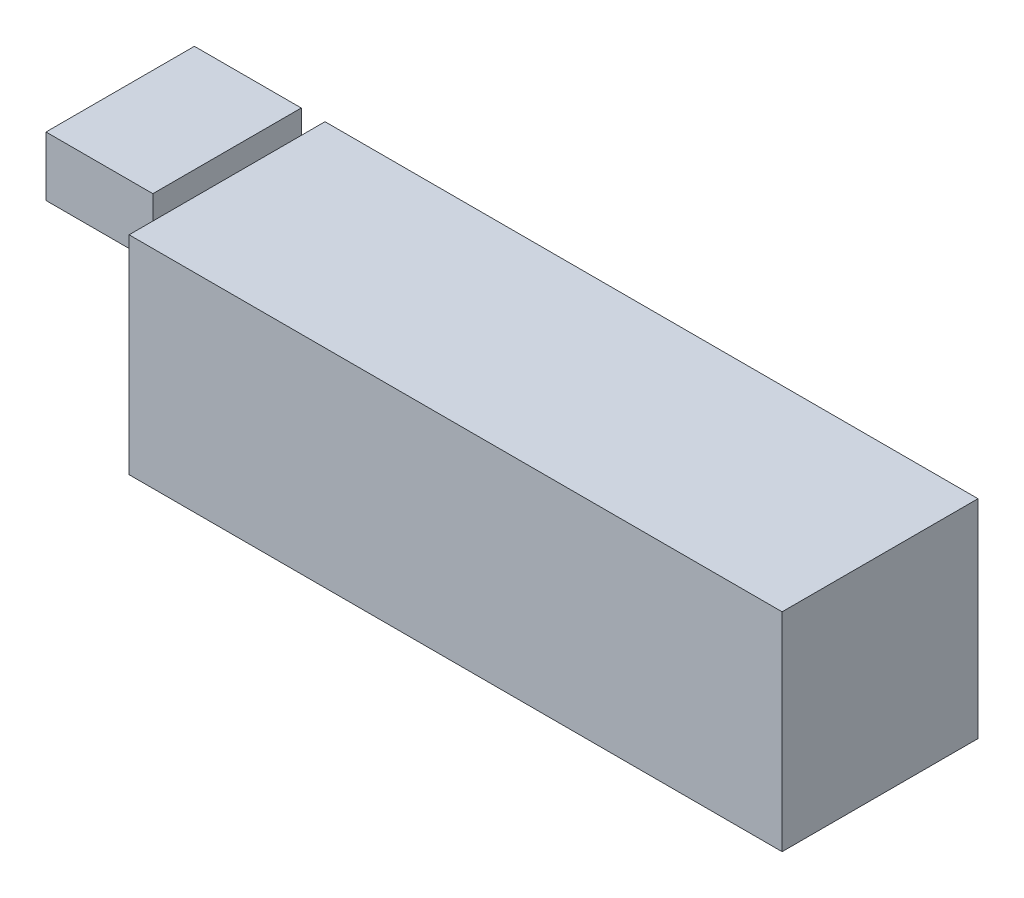
ISO-10303-21;
HEADER;
FILE_DESCRIPTION(('STEP AP214'),'2;1');
FILE_NAME('part.step','',(''),(''),'','','');
FILE_SCHEMA(('AUTOMOTIVE_DESIGN { 1 0 10303 214 1 1 1 1 }'));
ENDSEC;
DATA;
#1=APPLICATION_CONTEXT('core data for automotive mechanical design processes');
#2=APPLICATION_PROTOCOL_DEFINITION('international standard','automotive_design',2000,#1);
#3=PRODUCT_CONTEXT('',#1,'mechanical');
#4=PRODUCT('Part','Part','',(#3));
#5=PRODUCT_RELATED_PRODUCT_CATEGORY('part','',(#4));
#6=PRODUCT_DEFINITION_FORMATION('','',#4);
#7=PRODUCT_DEFINITION_CONTEXT('part definition',#1,'design');
#8=PRODUCT_DEFINITION('design','',#6,#7);
#9=PRODUCT_DEFINITION_SHAPE('','',#8);
#10=(LENGTH_UNIT() NAMED_UNIT(*) SI_UNIT(.MILLI.,.METRE.));
#11=(NAMED_UNIT(*) PLANE_ANGLE_UNIT() SI_UNIT($,.RADIAN.));
#12=(NAMED_UNIT(*) SI_UNIT($,.STERADIAN.) SOLID_ANGLE_UNIT());
#13=UNCERTAINTY_MEASURE_WITH_UNIT(LENGTH_MEASURE(1.E-05),#10,'distance_accuracy_value','');
#14=(GEOMETRIC_REPRESENTATION_CONTEXT(3) GLOBAL_UNCERTAINTY_ASSIGNED_CONTEXT((#13)) GLOBAL_UNIT_ASSIGNED_CONTEXT((#10,
#11,#12)) REPRESENTATION_CONTEXT('',''));
#15=CARTESIAN_POINT('',(0.,0.,0.));
#16=DIRECTION('',(0.,0.,1.));
#17=DIRECTION('',(1.,0.,0.));
#18=AXIS2_PLACEMENT_3D('',#15,#16,#17);
#19=CARTESIAN_POINT('',(0.,0.,33.));
#20=DIRECTION('',(1.,0.,0.));
#21=DIRECTION('',(0.,0.,-1.));
#22=AXIS2_PLACEMENT_3D('',#19,#20,#21);
#23=PLANE('',#22);
#24=DIRECTION('',(0.,1.,0.));
#25=VECTOR('',#24,1.);
#26=CARTESIAN_POINT('',(0.,39.,29.));
#27=LINE('',#26,#25);
#28=CARTESIAN_POINT('',(0.,29.,29.));
#29=VERTEX_POINT('',#28);
#30=CARTESIAN_POINT('',(0.,35.,29.));
#31=VERTEX_POINT('',#30);
#32=EDGE_CURVE('E51',#29,#31,#27,.T.);
#33=ORIENTED_EDGE('',*,*,#32,.F.);
#34=DIRECTION('',(0.,0.,1.));
#35=VECTOR('',#34,1.);
#36=CARTESIAN_POINT('',(0.,29.,4.));
#37=LINE('',#36,#35);
#38=CARTESIAN_POINT('',(0.,29.,4.));
#39=VERTEX_POINT('',#38);
#40=EDGE_CURVE('E124',#39,#29,#37,.T.);
#41=ORIENTED_EDGE('',*,*,#40,.F.);
#42=DIRECTION('',(0.,-1.,0.));
#43=VECTOR('',#42,1.);
#44=CARTESIAN_POINT('',(0.,39.,3.99999999999999));
#45=LINE('',#44,#43);
#46=CARTESIAN_POINT('',(0.,35.,4.));
#47=VERTEX_POINT('',#46);
#48=EDGE_CURVE('E11',#47,#39,#45,.T.);
#49=ORIENTED_EDGE('',*,*,#48,.F.);
#50=DIRECTION('',(0.,0.,-1.));
#51=VECTOR('',#50,1.);
#52=CARTESIAN_POINT('',(0.,35.,33.));
#53=LINE('',#52,#51);
#54=CARTESIAN_POINT('',(0.,35.,0.));
#55=VERTEX_POINT('',#54);
#56=EDGE_CURVE('E148',#47,#55,#53,.T.);
#57=ORIENTED_EDGE('',*,*,#56,.T.);
#58=DIRECTION('',(0.,-1.,0.));
#59=VECTOR('',#58,1.);
#60=CARTESIAN_POINT('',(0.,0.,0.));
#61=LINE('',#60,#59);
#62=CARTESIAN_POINT('',(0.,0.,0.));
#63=VERTEX_POINT('',#62);
#64=EDGE_CURVE('E130',#55,#63,#61,.T.);
#65=ORIENTED_EDGE('',*,*,#64,.T.);
#66=DIRECTION('',(0.,0.,-1.));
#67=VECTOR('',#66,1.);
#68=CARTESIAN_POINT('',(0.,0.,33.));
#69=LINE('',#68,#67);
#70=CARTESIAN_POINT('',(0.,0.,33.));
#71=VERTEX_POINT('',#70);
#72=EDGE_CURVE('E38',#71,#63,#69,.T.);
#73=ORIENTED_EDGE('',*,*,#72,.F.);
#74=DIRECTION('',(0.,-1.,0.));
#75=VECTOR('',#74,1.);
#76=CARTESIAN_POINT('',(0.,0.,33.));
#77=LINE('',#76,#75);
#78=CARTESIAN_POINT('',(0.,35.,33.));
#79=VERTEX_POINT('',#78);
#80=EDGE_CURVE('E139',#79,#71,#77,.T.);
#81=ORIENTED_EDGE('',*,*,#80,.F.);
#82=EDGE_CURVE('E155',#79,#31,#53,.T.);
#83=ORIENTED_EDGE('',*,*,#82,.T.);
#84=EDGE_LOOP('',(#33,#41,#49,#57,#65,#73,#81,#83));
#85=FACE_BOUND('',#84,.T.);
#86=ADVANCED_FACE('F35',(#85),#23,.F.);
#87=CARTESIAN_POINT('',(0.,0.,33.));
#88=DIRECTION('',(0.,1.,0.));
#89=DIRECTION('',(0.,0.,1.));
#90=AXIS2_PLACEMENT_3D('',#87,#88,#89);
#91=PLANE('',#90);
#92=DIRECTION('',(1.,0.,0.));
#93=VECTOR('',#92,1.);
#94=CARTESIAN_POINT('',(0.,0.,0.));
#95=LINE('',#94,#93);
#96=CARTESIAN_POINT('',(110.,0.,0.));
#97=VERTEX_POINT('',#96);
#98=EDGE_CURVE('E133',#63,#97,#95,.T.);
#99=ORIENTED_EDGE('',*,*,#98,.T.);
#100=DIRECTION('',(0.,0.,-1.));
#101=VECTOR('',#100,1.);
#102=CARTESIAN_POINT('',(110.,0.,33.));
#103=LINE('',#102,#101);
#104=CARTESIAN_POINT('',(110.,0.,33.));
#105=VERTEX_POINT('',#104);
#106=EDGE_CURVE('E160',#105,#97,#103,.T.);
#107=ORIENTED_EDGE('',*,*,#106,.F.);
#108=DIRECTION('',(1.,0.,0.));
#109=VECTOR('',#108,1.);
#110=CARTESIAN_POINT('',(0.,0.,33.));
#111=LINE('',#110,#109);
#112=EDGE_CURVE('E142',#71,#105,#111,.T.);
#113=ORIENTED_EDGE('',*,*,#112,.F.);
#114=ORIENTED_EDGE('',*,*,#72,.T.);
#115=EDGE_LOOP('',(#99,#107,#113,#114));
#116=FACE_BOUND('',#115,.T.);
#117=ADVANCED_FACE('F169',(#116),#91,.F.);
#118=CARTESIAN_POINT('',(110.,0.,33.));
#119=DIRECTION('',(-1.,0.,0.));
#120=DIRECTION('',(0.,0.,1.));
#121=AXIS2_PLACEMENT_3D('',#118,#119,#120);
#122=PLANE('',#121);
#123=DIRECTION('',(0.,1.,0.));
#124=VECTOR('',#123,1.);
#125=CARTESIAN_POINT('',(110.,0.,0.));
#126=LINE('',#125,#124);
#127=CARTESIAN_POINT('',(110.,35.,0.));
#128=VERTEX_POINT('',#127);
#129=EDGE_CURVE('E151',#97,#128,#126,.T.);
#130=ORIENTED_EDGE('',*,*,#129,.T.);
#131=DIRECTION('',(0.,0.,-1.));
#132=VECTOR('',#131,1.);
#133=CARTESIAN_POINT('',(110.,35.,33.));
#134=LINE('',#133,#132);
#135=CARTESIAN_POINT('',(110.,35.,33.));
#136=VERTEX_POINT('',#135);
#137=EDGE_CURVE('E157',#136,#128,#134,.T.);
#138=ORIENTED_EDGE('',*,*,#137,.F.);
#139=DIRECTION('',(0.,1.,0.));
#140=VECTOR('',#139,1.);
#141=CARTESIAN_POINT('',(110.,0.,33.));
#142=LINE('',#141,#140);
#143=EDGE_CURVE('E145',#105,#136,#142,.T.);
#144=ORIENTED_EDGE('',*,*,#143,.F.);
#145=ORIENTED_EDGE('',*,*,#106,.T.);
#146=EDGE_LOOP('',(#130,#138,#144,#145));
#147=FACE_BOUND('',#146,.T.);
#148=ADVANCED_FACE('F176',(#147),#122,.F.);
#149=CARTESIAN_POINT('',(0.,35.,33.));
#150=DIRECTION('',(0.,-1.,0.));
#151=DIRECTION('',(0.,0.,-1.));
#152=AXIS2_PLACEMENT_3D('',#149,#150,#151);
#153=PLANE('',#152);
#154=DIRECTION('',(-1.,0.,0.));
#155=VECTOR('',#154,1.);
#156=CARTESIAN_POINT('',(0.,35.,0.));
#157=LINE('',#156,#155);
#158=EDGE_CURVE('E143',#128,#55,#157,.T.);
#159=ORIENTED_EDGE('',*,*,#158,.T.);
#160=ORIENTED_EDGE('',*,*,#56,.F.);
#161=EDGE_CURVE('E158',#31,#47,#53,.T.);
#162=ORIENTED_EDGE('',*,*,#161,.F.);
#163=ORIENTED_EDGE('',*,*,#82,.F.);
#164=DIRECTION('',(-1.,0.,0.));
#165=VECTOR('',#164,1.);
#166=CARTESIAN_POINT('',(0.,35.,33.));
#167=LINE('',#166,#165);
#168=EDGE_CURVE('E147',#136,#79,#167,.T.);
#169=ORIENTED_EDGE('',*,*,#168,.F.);
#170=ORIENTED_EDGE('',*,*,#137,.T.);
#171=EDGE_LOOP('',(#159,#160,#162,#163,#169,#170));
#172=FACE_BOUND('',#171,.T.);
#173=ADVANCED_FACE('F179',(#172),#153,.F.);
#174=CARTESIAN_POINT('',(0.,0.,33.));
#175=DIRECTION('',(0.,0.,-1.));
#176=DIRECTION('',(-1.,0.,0.));
#177=AXIS2_PLACEMENT_3D('',#174,#175,#176);
#178=PLANE('',#177);
#179=ORIENTED_EDGE('',*,*,#80,.T.);
#180=ORIENTED_EDGE('',*,*,#112,.T.);
#181=ORIENTED_EDGE('',*,*,#143,.T.);
#182=ORIENTED_EDGE('',*,*,#168,.T.);
#183=EDGE_LOOP('',(#179,#180,#181,#182));
#184=FACE_BOUND('',#183,.T.);
#185=ADVANCED_FACE('F182',(#184),#178,.F.);
#186=CARTESIAN_POINT('',(0.,0.,0.));
#187=DIRECTION('',(0.,0.,-1.));
#188=DIRECTION('',(-1.,0.,0.));
#189=AXIS2_PLACEMENT_3D('',#186,#187,#188);
#190=PLANE('',#189);
#191=ORIENTED_EDGE('',*,*,#64,.F.);
#192=ORIENTED_EDGE('',*,*,#158,.F.);
#193=ORIENTED_EDGE('',*,*,#129,.F.);
#194=ORIENTED_EDGE('',*,*,#98,.F.);
#195=EDGE_LOOP('',(#191,#192,#193,#194));
#196=FACE_BOUND('',#195,.T.);
#197=ADVANCED_FACE('F174',(#196),#190,.T.);
#198=CARTESIAN_POINT('',(0.,0.,0.));
#199=DIRECTION('',(-1.,0.,0.));
#200=DIRECTION('',(0.,0.,1.));
#201=AXIS2_PLACEMENT_3D('',#198,#199,#200);
#202=PLANE('',#201);
#203=CARTESIAN_POINT('',(0.,39.,29.));
#204=VERTEX_POINT('',#203);
#205=EDGE_CURVE('E128',#31,#204,#27,.T.);
#206=ORIENTED_EDGE('',*,*,#205,.F.);
#207=ORIENTED_EDGE('',*,*,#161,.T.);
#208=CARTESIAN_POINT('',(0.,39.,3.99999999999999));
#209=VERTEX_POINT('',#208);
#210=EDGE_CURVE('E44',#209,#47,#45,.T.);
#211=ORIENTED_EDGE('',*,*,#210,.F.);
#212=DIRECTION('',(0.,0.,-1.));
#213=VECTOR('',#212,1.);
#214=CARTESIAN_POINT('',(0.,39.,3.99999999999999));
#215=LINE('',#214,#213);
#216=EDGE_CURVE('E188',#204,#209,#215,.T.);
#217=ORIENTED_EDGE('',*,*,#216,.F.);
#218=EDGE_LOOP('',(#206,#207,#211,#217));
#219=FACE_BOUND('',#218,.T.);
#220=ADVANCED_FACE('F185',(#219),#202,.F.);
#221=CARTESIAN_POINT('',(-18.,39.,29.));
#222=DIRECTION('',(0.,0.,-1.));
#223=DIRECTION('',(-1.,0.,0.));
#224=AXIS2_PLACEMENT_3D('',#221,#222,#223);
#225=PLANE('',#224);
#226=ORIENTED_EDGE('',*,*,#32,.T.);
#227=ORIENTED_EDGE('',*,*,#205,.T.);
#228=DIRECTION('',(1.,0.,0.));
#229=VECTOR('',#228,1.);
#230=CARTESIAN_POINT('',(-18.,39.,29.));
#231=LINE('',#230,#229);
#232=CARTESIAN_POINT('',(-18.,39.,29.));
#233=VERTEX_POINT('',#232);
#234=EDGE_CURVE('E109',#233,#204,#231,.T.);
#235=ORIENTED_EDGE('',*,*,#234,.F.);
#236=DIRECTION('',(0.,1.,0.));
#237=VECTOR('',#236,1.);
#238=CARTESIAN_POINT('',(-18.,39.,29.));
#239=LINE('',#238,#237);
#240=CARTESIAN_POINT('',(-18.,29.,29.));
#241=VERTEX_POINT('',#240);
#242=EDGE_CURVE('E115',#241,#233,#239,.T.);
#243=ORIENTED_EDGE('',*,*,#242,.F.);
#244=DIRECTION('',(1.,0.,0.));
#245=VECTOR('',#244,1.);
#246=CARTESIAN_POINT('',(-18.,29.,29.));
#247=LINE('',#246,#245);
#248=EDGE_CURVE('E190',#241,#29,#247,.T.);
#249=ORIENTED_EDGE('',*,*,#248,.T.);
#250=EDGE_LOOP('',(#226,#227,#235,#243,#249));
#251=FACE_BOUND('',#250,.T.);
#252=ADVANCED_FACE('F126',(#251),#225,.F.);
#253=CARTESIAN_POINT('',(-18.,39.,3.99999999999999));
#254=DIRECTION('',(0.,-1.,0.));
#255=DIRECTION('',(0.,0.,-1.));
#256=AXIS2_PLACEMENT_3D('',#253,#254,#255);
#257=PLANE('',#256);
#258=ORIENTED_EDGE('',*,*,#216,.T.);
#259=DIRECTION('',(1.,0.,0.));
#260=VECTOR('',#259,1.);
#261=CARTESIAN_POINT('',(-18.,39.,3.99999999999999));
#262=LINE('',#261,#260);
#263=CARTESIAN_POINT('',(-18.,39.,3.99999999999999));
#264=VERTEX_POINT('',#263);
#265=EDGE_CURVE('E111',#264,#209,#262,.T.);
#266=ORIENTED_EDGE('',*,*,#265,.F.);
#267=DIRECTION('',(0.,0.,-1.));
#268=VECTOR('',#267,1.);
#269=CARTESIAN_POINT('',(-18.,39.,3.99999999999999));
#270=LINE('',#269,#268);
#271=EDGE_CURVE('E105',#233,#264,#270,.T.);
#272=ORIENTED_EDGE('',*,*,#271,.F.);
#273=ORIENTED_EDGE('',*,*,#234,.T.);
#274=EDGE_LOOP('',(#258,#266,#272,#273));
#275=FACE_BOUND('',#274,.T.);
#276=ADVANCED_FACE('F107',(#275),#257,.F.);
#277=CARTESIAN_POINT('',(-18.,39.,3.99999999999999));
#278=DIRECTION('',(0.,0.,1.));
#279=DIRECTION('',(0.,-1.,0.));
#280=AXIS2_PLACEMENT_3D('',#277,#278,#279);
#281=PLANE('',#280);
#282=ORIENTED_EDGE('',*,*,#210,.T.);
#283=ORIENTED_EDGE('',*,*,#48,.T.);
#284=DIRECTION('',(1.,0.,0.));
#285=VECTOR('',#284,1.);
#286=CARTESIAN_POINT('',(-18.,29.,4.));
#287=LINE('',#286,#285);
#288=CARTESIAN_POINT('',(-18.,29.,4.));
#289=VERTEX_POINT('',#288);
#290=EDGE_CURVE('E135',#289,#39,#287,.T.);
#291=ORIENTED_EDGE('',*,*,#290,.F.);
#292=DIRECTION('',(0.,-1.,0.));
#293=VECTOR('',#292,1.);
#294=CARTESIAN_POINT('',(-18.,39.,3.99999999999999));
#295=LINE('',#294,#293);
#296=EDGE_CURVE('E114',#264,#289,#295,.T.);
#297=ORIENTED_EDGE('',*,*,#296,.F.);
#298=ORIENTED_EDGE('',*,*,#265,.T.);
#299=EDGE_LOOP('',(#282,#283,#291,#297,#298));
#300=FACE_BOUND('',#299,.T.);
#301=ADVANCED_FACE('F201',(#300),#281,.F.);
#302=CARTESIAN_POINT('',(-18.,29.,4.));
#303=DIRECTION('',(0.,1.,0.));
#304=DIRECTION('',(0.,0.,1.));
#305=AXIS2_PLACEMENT_3D('',#302,#303,#304);
#306=PLANE('',#305);
#307=ORIENTED_EDGE('',*,*,#40,.T.);
#308=ORIENTED_EDGE('',*,*,#248,.F.);
#309=DIRECTION('',(0.,0.,1.));
#310=VECTOR('',#309,1.);
#311=CARTESIAN_POINT('',(-18.,29.,4.));
#312=LINE('',#311,#310);
#313=EDGE_CURVE('E120',#289,#241,#312,.T.);
#314=ORIENTED_EDGE('',*,*,#313,.F.);
#315=ORIENTED_EDGE('',*,*,#290,.T.);
#316=EDGE_LOOP('',(#307,#308,#314,#315));
#317=FACE_BOUND('',#316,.T.);
#318=ADVANCED_FACE('F199',(#317),#306,.F.);
#319=CARTESIAN_POINT('',(-18.,0.,0.));
#320=DIRECTION('',(-1.,0.,0.));
#321=DIRECTION('',(0.,0.,1.));
#322=AXIS2_PLACEMENT_3D('',#319,#320,#321);
#323=PLANE('',#322);
#324=ORIENTED_EDGE('',*,*,#242,.T.);
#325=ORIENTED_EDGE('',*,*,#271,.T.);
#326=ORIENTED_EDGE('',*,*,#296,.T.);
#327=ORIENTED_EDGE('',*,*,#313,.T.);
#328=EDGE_LOOP('',(#324,#325,#326,#327));
#329=FACE_BOUND('',#328,.T.);
#330=ADVANCED_FACE('F118',(#329),#323,.T.);
#331=CLOSED_SHELL('',(#86,#117,#148,#173,#185,#197,#220,#252,#276,#301,#318,#330));
#332=MANIFOLD_SOLID_BREP('B2',#331);
#333=ADVANCED_BREP_SHAPE_REPRESENTATION('',(#18,#332),#14);
#334=SHAPE_DEFINITION_REPRESENTATION(#9,#333);
ENDSEC;
END-ISO-10303-21;
